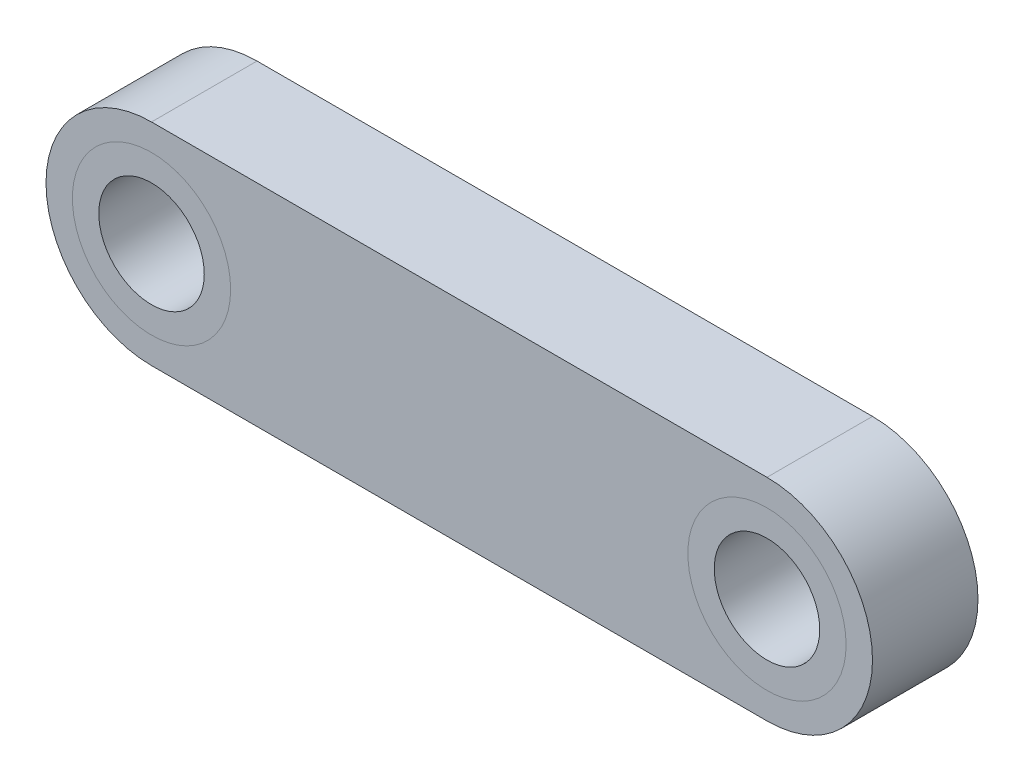
ISO-10303-21;
HEADER;
FILE_DESCRIPTION(('STEP AP214'),'2;1');
FILE_NAME('part.step','',(''),(''),'','','');
FILE_SCHEMA(('AUTOMOTIVE_DESIGN { 1 0 10303 214 1 1 1 1 }'));
ENDSEC;
DATA;
#1=APPLICATION_CONTEXT('core data for automotive mechanical design processes');
#2=APPLICATION_PROTOCOL_DEFINITION('international standard','automotive_design',2000,#1);
#3=PRODUCT_CONTEXT('',#1,'mechanical');
#4=PRODUCT('Part','Part','',(#3));
#5=PRODUCT_RELATED_PRODUCT_CATEGORY('part','',(#4));
#6=PRODUCT_DEFINITION_FORMATION('','',#4);
#7=PRODUCT_DEFINITION_CONTEXT('part definition',#1,'design');
#8=PRODUCT_DEFINITION('design','',#6,#7);
#9=PRODUCT_DEFINITION_SHAPE('','',#8);
#10=(LENGTH_UNIT() NAMED_UNIT(*) SI_UNIT(.MILLI.,.METRE.));
#11=(NAMED_UNIT(*) PLANE_ANGLE_UNIT() SI_UNIT($,.RADIAN.));
#12=(NAMED_UNIT(*) SI_UNIT($,.STERADIAN.) SOLID_ANGLE_UNIT());
#13=UNCERTAINTY_MEASURE_WITH_UNIT(LENGTH_MEASURE(1.E-05),#10,'distance_accuracy_value','');
#14=(GEOMETRIC_REPRESENTATION_CONTEXT(3) GLOBAL_UNCERTAINTY_ASSIGNED_CONTEXT((#13)) GLOBAL_UNIT_ASSIGNED_CONTEXT((#10,
#11,#12)) REPRESENTATION_CONTEXT('',''));
#15=CARTESIAN_POINT('',(0.,0.,0.));
#16=DIRECTION('',(0.,0.,1.));
#17=DIRECTION('',(1.,0.,0.));
#18=AXIS2_PLACEMENT_3D('',#15,#16,#17);
#19=CARTESIAN_POINT('',(17.5,0.,3.));
#20=DIRECTION('',(0.,0.,-1.));
#21=DIRECTION('',(-1.,0.,0.));
#22=AXIS2_PLACEMENT_3D('',#19,#20,#21);
#23=CYLINDRICAL_SURFACE('',#22,4.5);
#24=CARTESIAN_POINT('',(17.5,0.,3.));
#25=DIRECTION('',(0.,0.,1.));
#26=DIRECTION('',(1.,0.,0.));
#27=AXIS2_PLACEMENT_3D('',#24,#25,#26);
#28=CIRCLE('',#27,4.5);
#29=CARTESIAN_POINT('',(22.,0.,3.));
#30=VERTEX_POINT('',#29);
#31=EDGE_CURVE('E53',#30,#30,#28,.F.);
#32=ORIENTED_EDGE('',*,*,#31,.T.);
#33=EDGE_LOOP('',(#32));
#34=FACE_BOUND('',#33,.T.);
#35=CARTESIAN_POINT('',(17.5,0.,-3.));
#36=DIRECTION('',(0.,0.,1.));
#37=DIRECTION('',(1.,0.,0.));
#38=AXIS2_PLACEMENT_3D('',#35,#36,#37);
#39=CIRCLE('',#38,4.5);
#40=CARTESIAN_POINT('',(22.,0.,-3.));
#41=VERTEX_POINT('',#40);
#42=EDGE_CURVE('E59',#41,#41,#39,.F.);
#43=ORIENTED_EDGE('',*,*,#42,.F.);
#44=EDGE_LOOP('',(#43));
#45=FACE_BOUND('',#44,.T.);
#46=ADVANCED_FACE('F46',(#34,#45),#23,.T.);
#47=CARTESIAN_POINT('',(17.5,0.,3.));
#48=DIRECTION('',(0.,0.,-1.));
#49=DIRECTION('',(-1.,0.,0.));
#50=AXIS2_PLACEMENT_3D('',#47,#48,#49);
#51=CYLINDRICAL_SURFACE('',#50,3.);
#52=CARTESIAN_POINT('',(17.5,0.,3.));
#53=DIRECTION('',(0.,0.,1.));
#54=DIRECTION('',(1.,0.,0.));
#55=AXIS2_PLACEMENT_3D('',#52,#53,#54);
#56=CIRCLE('',#55,3.);
#57=CARTESIAN_POINT('',(20.5,0.,3.));
#58=VERTEX_POINT('',#57);
#59=EDGE_CURVE('E11',#58,#58,#56,.F.);
#60=ORIENTED_EDGE('',*,*,#59,.F.);
#61=EDGE_LOOP('',(#60));
#62=FACE_BOUND('',#61,.T.);
#63=CARTESIAN_POINT('',(17.5,0.,-3.));
#64=DIRECTION('',(0.,0.,1.));
#65=DIRECTION('',(1.,0.,0.));
#66=AXIS2_PLACEMENT_3D('',#63,#64,#65);
#67=CIRCLE('',#66,3.);
#68=CARTESIAN_POINT('',(20.5,0.,-3.));
#69=VERTEX_POINT('',#68);
#70=EDGE_CURVE('E49',#69,#69,#67,.F.);
#71=ORIENTED_EDGE('',*,*,#70,.T.);
#72=EDGE_LOOP('',(#71));
#73=FACE_BOUND('',#72,.T.);
#74=ADVANCED_FACE('F66',(#62,#73),#51,.F.);
#75=CARTESIAN_POINT('',(0.,0.,3.));
#76=DIRECTION('',(0.,0.,1.));
#77=DIRECTION('',(1.,0.,0.));
#78=AXIS2_PLACEMENT_3D('',#75,#76,#77);
#79=PLANE('',#78);
#80=ORIENTED_EDGE('',*,*,#31,.F.);
#81=EDGE_LOOP('',(#80));
#82=FACE_BOUND('',#81,.T.);
#83=ORIENTED_EDGE('',*,*,#59,.T.);
#84=EDGE_LOOP('',(#83));
#85=FACE_BOUND('',#84,.T.);
#86=ADVANCED_FACE('F70',(#82,#85),#79,.T.);
#87=CARTESIAN_POINT('',(0.,0.,-3.));
#88=DIRECTION('',(0.,0.,1.));
#89=DIRECTION('',(1.,0.,0.));
#90=AXIS2_PLACEMENT_3D('',#87,#88,#89);
#91=PLANE('',#90);
#92=ORIENTED_EDGE('',*,*,#42,.T.);
#93=EDGE_LOOP('',(#92));
#94=FACE_BOUND('',#93,.T.);
#95=ORIENTED_EDGE('',*,*,#70,.F.);
#96=EDGE_LOOP('',(#95));
#97=FACE_BOUND('',#96,.T.);
#98=ADVANCED_FACE('F68',(#94,#97),#91,.F.);
#99=CLOSED_SHELL('',(#46,#74,#86,#98));
#100=MANIFOLD_SOLID_BREP('B2',#99);
#101=CARTESIAN_POINT('',(-17.5,0.,3.));
#102=DIRECTION('',(0.,0.,-1.));
#103=DIRECTION('',(-1.,0.,0.));
#104=AXIS2_PLACEMENT_3D('',#101,#102,#103);
#105=CYLINDRICAL_SURFACE('',#104,3.);
#106=CARTESIAN_POINT('',(-17.5,0.,3.));
#107=DIRECTION('',(0.,0.,1.));
#108=DIRECTION('',(1.,0.,0.));
#109=AXIS2_PLACEMENT_3D('',#106,#107,#108);
#110=CIRCLE('',#109,3.);
#111=CARTESIAN_POINT('',(-14.5,0.,3.));
#112=VERTEX_POINT('',#111);
#113=EDGE_CURVE('E124',#112,#112,#110,.T.);
#114=ORIENTED_EDGE('',*,*,#113,.T.);
#115=EDGE_LOOP('',(#114));
#116=FACE_BOUND('',#115,.T.);
#117=CARTESIAN_POINT('',(-17.5,0.,-3.));
#118=DIRECTION('',(0.,0.,1.));
#119=DIRECTION('',(1.,0.,0.));
#120=AXIS2_PLACEMENT_3D('',#117,#118,#119);
#121=CIRCLE('',#120,3.);
#122=CARTESIAN_POINT('',(-14.5,0.,-3.));
#123=VERTEX_POINT('',#122);
#124=EDGE_CURVE('E130',#123,#123,#121,.T.);
#125=ORIENTED_EDGE('',*,*,#124,.F.);
#126=EDGE_LOOP('',(#125));
#127=FACE_BOUND('',#126,.T.);
#128=ADVANCED_FACE('F117',(#116,#127),#105,.F.);
#129=CARTESIAN_POINT('',(-17.5,0.,3.));
#130=DIRECTION('',(0.,0.,-1.));
#131=DIRECTION('',(-1.,0.,0.));
#132=AXIS2_PLACEMENT_3D('',#129,#130,#131);
#133=CYLINDRICAL_SURFACE('',#132,4.5);
#134=CARTESIAN_POINT('',(-17.5,0.,3.));
#135=DIRECTION('',(0.,0.,1.));
#136=DIRECTION('',(1.,0.,0.));
#137=AXIS2_PLACEMENT_3D('',#134,#135,#136);
#138=CIRCLE('',#137,4.5);
#139=CARTESIAN_POINT('',(-13.,0.,3.));
#140=VERTEX_POINT('',#139);
#141=EDGE_CURVE('E45',#140,#140,#138,.T.);
#142=ORIENTED_EDGE('',*,*,#141,.F.);
#143=EDGE_LOOP('',(#142));
#144=FACE_BOUND('',#143,.T.);
#145=CARTESIAN_POINT('',(-17.5,0.,-3.));
#146=DIRECTION('',(0.,0.,1.));
#147=DIRECTION('',(1.,0.,0.));
#148=AXIS2_PLACEMENT_3D('',#145,#146,#147);
#149=CIRCLE('',#148,4.5);
#150=CARTESIAN_POINT('',(-13.,0.,-3.));
#151=VERTEX_POINT('',#150);
#152=EDGE_CURVE('E120',#151,#151,#149,.T.);
#153=ORIENTED_EDGE('',*,*,#152,.T.);
#154=EDGE_LOOP('',(#153));
#155=FACE_BOUND('',#154,.T.);
#156=ADVANCED_FACE('F137',(#144,#155),#133,.T.);
#157=CARTESIAN_POINT('',(0.,0.,3.));
#158=DIRECTION('',(0.,0.,1.));
#159=DIRECTION('',(1.,0.,0.));
#160=AXIS2_PLACEMENT_3D('',#157,#158,#159);
#161=PLANE('',#160);
#162=ORIENTED_EDGE('',*,*,#113,.F.);
#163=EDGE_LOOP('',(#162));
#164=FACE_BOUND('',#163,.T.);
#165=ORIENTED_EDGE('',*,*,#141,.T.);
#166=EDGE_LOOP('',(#165));
#167=FACE_BOUND('',#166,.T.);
#168=ADVANCED_FACE('F141',(#164,#167),#161,.T.);
#169=CARTESIAN_POINT('',(0.,0.,-3.));
#170=DIRECTION('',(0.,0.,1.));
#171=DIRECTION('',(1.,0.,0.));
#172=AXIS2_PLACEMENT_3D('',#169,#170,#171);
#173=PLANE('',#172);
#174=ORIENTED_EDGE('',*,*,#124,.T.);
#175=EDGE_LOOP('',(#174));
#176=FACE_BOUND('',#175,.T.);
#177=ORIENTED_EDGE('',*,*,#152,.F.);
#178=EDGE_LOOP('',(#177));
#179=FACE_BOUND('',#178,.T.);
#180=ADVANCED_FACE('F139',(#176,#179),#173,.F.);
#181=CLOSED_SHELL('',(#128,#156,#168,#180));
#182=MANIFOLD_SOLID_BREP('B6',#181);
#183=CARTESIAN_POINT('',(0.,-6.,3.));
#184=DIRECTION('',(0.,1.,0.));
#185=DIRECTION('',(-1.,0.,0.));
#186=AXIS2_PLACEMENT_3D('',#183,#184,#185);
#187=PLANE('',#186);
#188=DIRECTION('',(1.,0.,0.));
#189=VECTOR('',#188,1.);
#190=CARTESIAN_POINT('',(0.,-6.,-3.));
#191=LINE('',#190,#189);
#192=CARTESIAN_POINT('',(-17.5,-6.,-3.));
#193=VERTEX_POINT('',#192);
#194=CARTESIAN_POINT('',(17.5,-5.99999999999999,-3.));
#195=VERTEX_POINT('',#194);
#196=EDGE_CURVE('E249',#193,#195,#191,.T.);
#197=ORIENTED_EDGE('',*,*,#196,.T.);
#198=DIRECTION('',(0.,0.,-1.));
#199=VECTOR('',#198,1.);
#200=CARTESIAN_POINT('',(17.5,-5.99999999999999,3.));
#201=LINE('',#200,#199);
#202=CARTESIAN_POINT('',(17.5,-5.99999999999999,3.));
#203=VERTEX_POINT('',#202);
#204=EDGE_CURVE('E115',#203,#195,#201,.T.);
#205=ORIENTED_EDGE('',*,*,#204,.F.);
#206=DIRECTION('',(1.,0.,0.));
#207=VECTOR('',#206,1.);
#208=CARTESIAN_POINT('',(0.,-6.,3.));
#209=LINE('',#208,#207);
#210=CARTESIAN_POINT('',(-17.5,-6.,3.));
#211=VERTEX_POINT('',#210);
#212=EDGE_CURVE('E228',#211,#203,#209,.T.);
#213=ORIENTED_EDGE('',*,*,#212,.F.);
#214=DIRECTION('',(0.,0.,-1.));
#215=VECTOR('',#214,1.);
#216=CARTESIAN_POINT('',(-17.5,-6.,3.));
#217=LINE('',#216,#215);
#218=EDGE_CURVE('E245',#211,#193,#217,.T.);
#219=ORIENTED_EDGE('',*,*,#218,.T.);
#220=EDGE_LOOP('',(#197,#205,#213,#219));
#221=FACE_BOUND('',#220,.T.);
#222=ADVANCED_FACE('F179',(#221),#187,.F.);
#223=CARTESIAN_POINT('',(17.5,0.,3.));
#224=DIRECTION('',(0.,0.,-1.));
#225=DIRECTION('',(-1.,0.,0.));
#226=AXIS2_PLACEMENT_3D('',#223,#224,#225);
#227=CYLINDRICAL_SURFACE('',#226,6.);
#228=CARTESIAN_POINT('',(17.5,0.,-3.));
#229=DIRECTION('',(0.,0.,1.));
#230=DIRECTION('',(1.,0.,0.));
#231=AXIS2_PLACEMENT_3D('',#228,#229,#230);
#232=CIRCLE('',#231,6.);
#233=CARTESIAN_POINT('',(17.5,6.00000000000001,-3.));
#234=VERTEX_POINT('',#233);
#235=EDGE_CURVE('E233',#195,#234,#232,.T.);
#236=ORIENTED_EDGE('',*,*,#235,.T.);
#237=DIRECTION('',(0.,0.,-1.));
#238=VECTOR('',#237,1.);
#239=CARTESIAN_POINT('',(17.5,6.00000000000001,3.));
#240=LINE('',#239,#238);
#241=CARTESIAN_POINT('',(17.5,6.00000000000001,3.));
#242=VERTEX_POINT('',#241);
#243=EDGE_CURVE('E188',#242,#234,#240,.T.);
#244=ORIENTED_EDGE('',*,*,#243,.F.);
#245=CARTESIAN_POINT('',(17.5,0.,3.));
#246=DIRECTION('',(0.,0.,1.));
#247=DIRECTION('',(1.,0.,0.));
#248=AXIS2_PLACEMENT_3D('',#245,#246,#247);
#249=CIRCLE('',#248,6.);
#250=EDGE_CURVE('E222',#203,#242,#249,.T.);
#251=ORIENTED_EDGE('',*,*,#250,.F.);
#252=ORIENTED_EDGE('',*,*,#204,.T.);
#253=EDGE_LOOP('',(#236,#244,#251,#252));
#254=FACE_BOUND('',#253,.T.);
#255=ADVANCED_FACE('F232',(#254),#227,.T.);
#256=CARTESIAN_POINT('',(0.,6.,3.));
#257=DIRECTION('',(0.,1.,0.));
#258=DIRECTION('',(-1.,0.,0.));
#259=AXIS2_PLACEMENT_3D('',#256,#257,#258);
#260=PLANE('',#259);
#261=DIRECTION('',(1.,0.,0.));
#262=VECTOR('',#261,1.);
#263=CARTESIAN_POINT('',(0.,6.,-3.));
#264=LINE('',#263,#262);
#265=CARTESIAN_POINT('',(-17.5,6.,-3.));
#266=VERTEX_POINT('',#265);
#267=EDGE_CURVE('E253',#266,#234,#264,.T.);
#268=ORIENTED_EDGE('',*,*,#267,.F.);
#269=DIRECTION('',(0.,0.,-1.));
#270=VECTOR('',#269,1.);
#271=CARTESIAN_POINT('',(-17.5,6.,3.));
#272=LINE('',#271,#270);
#273=CARTESIAN_POINT('',(-17.5,6.,3.));
#274=VERTEX_POINT('',#273);
#275=EDGE_CURVE('E212',#274,#266,#272,.T.);
#276=ORIENTED_EDGE('',*,*,#275,.F.);
#277=DIRECTION('',(1.,0.,0.));
#278=VECTOR('',#277,1.);
#279=CARTESIAN_POINT('',(0.,6.,3.));
#280=LINE('',#279,#278);
#281=EDGE_CURVE('E226',#274,#242,#280,.T.);
#282=ORIENTED_EDGE('',*,*,#281,.T.);
#283=ORIENTED_EDGE('',*,*,#243,.T.);
#284=EDGE_LOOP('',(#268,#276,#282,#283));
#285=FACE_BOUND('',#284,.T.);
#286=ADVANCED_FACE('F237',(#285),#260,.T.);
#287=CARTESIAN_POINT('',(-17.5,0.,3.));
#288=DIRECTION('',(0.,0.,-1.));
#289=DIRECTION('',(-1.,0.,0.));
#290=AXIS2_PLACEMENT_3D('',#287,#288,#289);
#291=CYLINDRICAL_SURFACE('',#290,6.);
#292=CARTESIAN_POINT('',(-17.5,0.,-3.));
#293=DIRECTION('',(0.,0.,1.));
#294=DIRECTION('',(1.,0.,0.));
#295=AXIS2_PLACEMENT_3D('',#292,#293,#294);
#296=CIRCLE('',#295,6.);
#297=EDGE_CURVE('E215',#266,#193,#296,.T.);
#298=ORIENTED_EDGE('',*,*,#297,.T.);
#299=ORIENTED_EDGE('',*,*,#218,.F.);
#300=CARTESIAN_POINT('',(-17.5,0.,3.));
#301=DIRECTION('',(0.,0.,1.));
#302=DIRECTION('',(1.,0.,0.));
#303=AXIS2_PLACEMENT_3D('',#300,#301,#302);
#304=CIRCLE('',#303,6.);
#305=EDGE_CURVE('E196',#274,#211,#304,.T.);
#306=ORIENTED_EDGE('',*,*,#305,.F.);
#307=ORIENTED_EDGE('',*,*,#275,.T.);
#308=EDGE_LOOP('',(#298,#299,#306,#307));
#309=FACE_BOUND('',#308,.T.);
#310=ADVANCED_FACE('F281',(#309),#291,.T.);
#311=CARTESIAN_POINT('',(-17.5,0.,3.));
#312=DIRECTION('',(0.,0.,-1.));
#313=DIRECTION('',(-1.,0.,0.));
#314=AXIS2_PLACEMENT_3D('',#311,#312,#313);
#315=CYLINDRICAL_SURFACE('',#314,4.5);
#316=CARTESIAN_POINT('',(-17.5,0.,3.));
#317=DIRECTION('',(0.,0.,1.));
#318=DIRECTION('',(1.,0.,0.));
#319=AXIS2_PLACEMENT_3D('',#316,#317,#318);
#320=CIRCLE('',#319,4.5);
#321=CARTESIAN_POINT('',(-13.,0.,3.));
#322=VERTEX_POINT('',#321);
#323=EDGE_CURVE('E259',#322,#322,#320,.T.);
#324=ORIENTED_EDGE('',*,*,#323,.T.);
#325=EDGE_LOOP('',(#324));
#326=FACE_BOUND('',#325,.T.);
#327=CARTESIAN_POINT('',(-17.5,0.,-3.));
#328=DIRECTION('',(0.,0.,1.));
#329=DIRECTION('',(1.,0.,0.));
#330=AXIS2_PLACEMENT_3D('',#327,#328,#329);
#331=CIRCLE('',#330,4.5);
#332=CARTESIAN_POINT('',(-13.,0.,-3.));
#333=VERTEX_POINT('',#332);
#334=EDGE_CURVE('E246',#333,#333,#331,.T.);
#335=ORIENTED_EDGE('',*,*,#334,.F.);
#336=EDGE_LOOP('',(#335));
#337=FACE_BOUND('',#336,.T.);
#338=ADVANCED_FACE('F181',(#326,#337),#315,.F.);
#339=CARTESIAN_POINT('',(17.5,0.,3.));
#340=DIRECTION('',(0.,0.,-1.));
#341=DIRECTION('',(-1.,0.,0.));
#342=AXIS2_PLACEMENT_3D('',#339,#340,#341);
#343=CYLINDRICAL_SURFACE('',#342,4.5);
#344=CARTESIAN_POINT('',(17.5,0.,3.));
#345=DIRECTION('',(0.,0.,1.));
#346=DIRECTION('',(1.,0.,0.));
#347=AXIS2_PLACEMENT_3D('',#344,#345,#346);
#348=CIRCLE('',#347,4.5);
#349=CARTESIAN_POINT('',(22.,0.,3.));
#350=VERTEX_POINT('',#349);
#351=EDGE_CURVE('E239',#350,#350,#348,.F.);
#352=ORIENTED_EDGE('',*,*,#351,.F.);
#353=EDGE_LOOP('',(#352));
#354=FACE_BOUND('',#353,.T.);
#355=CARTESIAN_POINT('',(17.5,0.,-3.));
#356=DIRECTION('',(0.,0.,1.));
#357=DIRECTION('',(1.,0.,0.));
#358=AXIS2_PLACEMENT_3D('',#355,#356,#357);
#359=CIRCLE('',#358,4.5);
#360=CARTESIAN_POINT('',(22.,0.,-3.));
#361=VERTEX_POINT('',#360);
#362=EDGE_CURVE('E256',#361,#361,#359,.F.);
#363=ORIENTED_EDGE('',*,*,#362,.T.);
#364=EDGE_LOOP('',(#363));
#365=FACE_BOUND('',#364,.T.);
#366=ADVANCED_FACE('F271',(#354,#365),#343,.F.);
#367=CARTESIAN_POINT('',(0.,0.,3.));
#368=DIRECTION('',(0.,0.,1.));
#369=DIRECTION('',(1.,0.,0.));
#370=AXIS2_PLACEMENT_3D('',#367,#368,#369);
#371=PLANE('',#370);
#372=ORIENTED_EDGE('',*,*,#323,.F.);
#373=EDGE_LOOP('',(#372));
#374=FACE_BOUND('',#373,.T.);
#375=ORIENTED_EDGE('',*,*,#212,.T.);
#376=ORIENTED_EDGE('',*,*,#250,.T.);
#377=ORIENTED_EDGE('',*,*,#281,.F.);
#378=ORIENTED_EDGE('',*,*,#305,.T.);
#379=EDGE_LOOP('',(#375,#376,#377,#378));
#380=FACE_BOUND('',#379,.T.);
#381=ORIENTED_EDGE('',*,*,#351,.T.);
#382=EDGE_LOOP('',(#381));
#383=FACE_BOUND('',#382,.T.);
#384=ADVANCED_FACE('F223',(#374,#380,#383),#371,.T.);
#385=CARTESIAN_POINT('',(0.,0.,-3.));
#386=DIRECTION('',(0.,0.,1.));
#387=DIRECTION('',(1.,0.,0.));
#388=AXIS2_PLACEMENT_3D('',#385,#386,#387);
#389=PLANE('',#388);
#390=ORIENTED_EDGE('',*,*,#334,.T.);
#391=EDGE_LOOP('',(#390));
#392=FACE_BOUND('',#391,.T.);
#393=ORIENTED_EDGE('',*,*,#196,.F.);
#394=ORIENTED_EDGE('',*,*,#297,.F.);
#395=ORIENTED_EDGE('',*,*,#267,.T.);
#396=ORIENTED_EDGE('',*,*,#235,.F.);
#397=EDGE_LOOP('',(#393,#394,#395,#396));
#398=FACE_BOUND('',#397,.T.);
#399=ORIENTED_EDGE('',*,*,#362,.F.);
#400=EDGE_LOOP('',(#399));
#401=FACE_BOUND('',#400,.T.);
#402=ADVANCED_FACE('F264',(#392,#398,#401),#389,.F.);
#403=CLOSED_SHELL('',(#222,#255,#286,#310,#338,#366,#384,#402));
#404=MANIFOLD_SOLID_BREP('B40',#403);
#405=ADVANCED_BREP_SHAPE_REPRESENTATION('',(#18,#100,#182,#404),#14);
#406=SHAPE_DEFINITION_REPRESENTATION(#9,#405);
ENDSEC;
END-ISO-10303-21;
